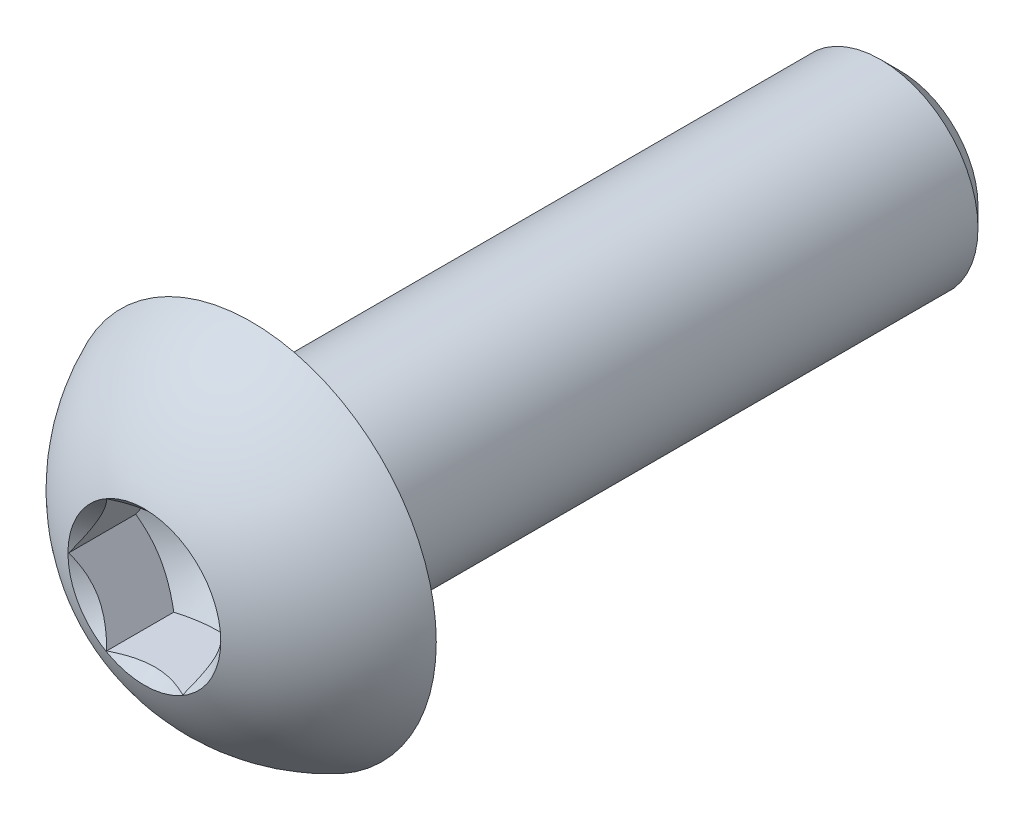
ISO-10303-21;
HEADER;
FILE_DESCRIPTION(('STEP AP214'),'2;1');
FILE_NAME('part.step','',(''),(''),'','','');
FILE_SCHEMA(('AUTOMOTIVE_DESIGN { 1 0 10303 214 1 1 1 1 }'));
ENDSEC;
DATA;
#1=APPLICATION_CONTEXT('core data for automotive mechanical design processes');
#2=APPLICATION_PROTOCOL_DEFINITION('international standard','automotive_design',2000,#1);
#3=PRODUCT_CONTEXT('',#1,'mechanical');
#4=PRODUCT('Part','Part','',(#3));
#5=PRODUCT_RELATED_PRODUCT_CATEGORY('part','',(#4));
#6=PRODUCT_DEFINITION_FORMATION('','',#4);
#7=PRODUCT_DEFINITION_CONTEXT('part definition',#1,'design');
#8=PRODUCT_DEFINITION('design','',#6,#7);
#9=PRODUCT_DEFINITION_SHAPE('','',#8);
#10=(LENGTH_UNIT() NAMED_UNIT(*) SI_UNIT(.MILLI.,.METRE.));
#11=(NAMED_UNIT(*) PLANE_ANGLE_UNIT() SI_UNIT($,.RADIAN.));
#12=(NAMED_UNIT(*) SI_UNIT($,.STERADIAN.) SOLID_ANGLE_UNIT());
#13=UNCERTAINTY_MEASURE_WITH_UNIT(LENGTH_MEASURE(1.E-05),#10,'distance_accuracy_value','');
#14=(GEOMETRIC_REPRESENTATION_CONTEXT(3) GLOBAL_UNCERTAINTY_ASSIGNED_CONTEXT((#13)) GLOBAL_UNIT_ASSIGNED_CONTEXT((#10,
#11,#12)) REPRESENTATION_CONTEXT('',''));
#15=CARTESIAN_POINT('',(0.,0.,0.));
#16=DIRECTION('',(0.,0.,1.));
#17=DIRECTION('',(1.,0.,0.));
#18=AXIS2_PLACEMENT_3D('',#15,#16,#17);
#19=CARTESIAN_POINT('',(0.,0.,-10.));
#20=DIRECTION('',(0.,0.,1.));
#21=DIRECTION('',(1.,0.,0.));
#22=AXIS2_PLACEMENT_3D('',#19,#20,#21);
#23=PLANE('',#22);
#24=CARTESIAN_POINT('',(0.,0.,-10.));
#25=DIRECTION('',(0.,0.,1.));
#26=DIRECTION('',(1.,0.,0.));
#27=AXIS2_PLACEMENT_3D('',#24,#25,#26);
#28=CIRCLE('',#27,1.2);
#29=CARTESIAN_POINT('',(1.2,0.,-10.));
#30=VERTEX_POINT('',#29);
#31=EDGE_CURVE('E11',#30,#30,#28,.T.);
#32=ORIENTED_EDGE('',*,*,#31,.F.);
#33=EDGE_LOOP('',(#32));
#34=FACE_BOUND('',#33,.T.);
#35=ADVANCED_FACE('F17',(#34),#23,.F.);
#36=CARTESIAN_POINT('',(0.,0.,0.02709501704973));
#37=DIRECTION('',(0.,0.,-1.));
#38=DIRECTION('',(0.,-1.,0.));
#39=AXIS2_PLACEMENT_3D('',#36,#37,#38);
#40=PLANE('',#39);
#41=CARTESIAN_POINT('',(0.,0.,0.02709501704973));
#42=DIRECTION('',(0.,0.,-1.));
#43=DIRECTION('',(-1.,0.,0.));
#44=AXIS2_PLACEMENT_3D('',#41,#42,#43);
#45=CIRCLE('',#44,0.1624);
#46=CARTESIAN_POINT('',(-0.1624,0.,0.02709501704973));
#47=VERTEX_POINT('',#46);
#48=EDGE_CURVE('E157',#47,#47,#45,.T.);
#49=ORIENTED_EDGE('',*,*,#48,.F.);
#50=EDGE_LOOP('',(#49));
#51=FACE_BOUND('',#50,.T.);
#52=ADVANCED_FACE('F326',(#51),#40,.F.);
#53=CARTESIAN_POINT('',(0.,0.,-9.7));
#54=DIRECTION('',(0.,0.,1.));
#55=DIRECTION('',(1.,0.,0.));
#56=AXIS2_PLACEMENT_3D('',#53,#54,#55);
#57=CONICAL_SURFACE('',#56,1.5,0.785398163397);
#58=DIRECTION('',(-0.707106781186548,0.,-0.707106781186548));
#59=VECTOR('',#58,1.);
#60=CARTESIAN_POINT('',(1.5,0.,-9.7));
#61=LINE('',#60,#59);
#62=CARTESIAN_POINT('',(1.5,0.,-9.7));
#63=VERTEX_POINT('',#62);
#64=EDGE_CURVE('E30',#63,#30,#61,.T.);
#65=ORIENTED_EDGE('',*,*,#64,.T.);
#66=ORIENTED_EDGE('',*,*,#31,.T.);
#67=ORIENTED_EDGE('',*,*,#64,.F.);
#68=CARTESIAN_POINT('',(0.,0.,-9.7));
#69=DIRECTION('',(0.,0.,1.));
#70=DIRECTION('',(1.,0.,0.));
#71=AXIS2_PLACEMENT_3D('',#68,#69,#70);
#72=CIRCLE('',#71,1.5);
#73=EDGE_CURVE('E148',#63,#63,#72,.T.);
#74=ORIENTED_EDGE('',*,*,#73,.F.);
#75=EDGE_LOOP('',(#65,#66,#67,#74));
#76=FACE_BOUND('',#75,.T.);
#77=ADVANCED_FACE('F163',(#76),#57,.T.);
#78=CARTESIAN_POINT('',(0.,0.,2.69));
#79=DIRECTION('',(0.,0.,1.));
#80=DIRECTION('',(-1.,0.,0.));
#81=AXIS2_PLACEMENT_3D('',#78,#79,#80);
#82=CONICAL_SURFACE('',#81,4.774686726198,1.047197551197);
#83=CARTESIAN_POINT('',(-1.17202104645414,-1.28130839271989E-12,0.609999999999112));
#84=CARTESIAN_POINT('',(-0.879015784840616,-0.507500000000666,0.440833333332957));
#85=CARTESIAN_POINT('',(-0.586010523226831,-1.01500000000049,0.609999999999704));
#86=(BOUNDED_CURVE() B_SPLINE_CURVE(2,(#83,#84,#85),.UNSPECIFIED.,.F.,
.F.) B_SPLINE_CURVE_WITH_KNOTS((3,3),(0.,1.),
.UNSPECIFIED.) CURVE() GEOMETRIC_REPRESENTATION_ITEM() RATIONAL_B_SPLINE_CURVE((1.,
1.15470053837917,1.)) REPRESENTATION_ITEM(''));
#87=CARTESIAN_POINT('',(-1.172021046455,0.,0.61));
#88=VERTEX_POINT('',#87);
#89=CARTESIAN_POINT('',(-0.586010523227,-1.015,0.61));
#90=VERTEX_POINT('',#89);
#91=EDGE_CURVE('E100',#88,#90,#86,.T.);
#92=ORIENTED_EDGE('',*,*,#91,.T.);
#93=CARTESIAN_POINT('',(-0.586010523224638,-1.015,0.609999999998636));
#94=CARTESIAN_POINT('',(1.18138832050363E-12,-1.015,0.440833333333196));
#95=CARTESIAN_POINT('',(0.586010523227788,-1.015,0.609999999999545));
#96=(BOUNDED_CURVE() B_SPLINE_CURVE(2,(#93,#94,#95),.UNSPECIFIED.,.F.,
.F.) B_SPLINE_CURVE_WITH_KNOTS((3,3),(0.,1.),
.UNSPECIFIED.) CURVE() GEOMETRIC_REPRESENTATION_ITEM() RATIONAL_B_SPLINE_CURVE((1.,
1.15470053837863,1.)) REPRESENTATION_ITEM(''));
#97=CARTESIAN_POINT('',(0.586010523227,-1.015,0.61));
#98=VERTEX_POINT('',#97);
#99=EDGE_CURVE('E93',#90,#98,#96,.T.);
#100=ORIENTED_EDGE('',*,*,#99,.T.);
#101=CARTESIAN_POINT('',(0.586010523227856,-1.01499999999872,0.609999999999113));
#102=CARTESIAN_POINT('',(0.879015784841384,-0.507499999999334,0.440833333332957));
#103=CARTESIAN_POINT('',(1.17202104645517,4.94160268260657E-13,0.609999999999704));
#104=(BOUNDED_CURVE() B_SPLINE_CURVE(2,(#101,#102,#103),.UNSPECIFIED.,.F.,
.F.) B_SPLINE_CURVE_WITH_KNOTS((3,3),(0.,1.),
.UNSPECIFIED.) CURVE() GEOMETRIC_REPRESENTATION_ITEM() RATIONAL_B_SPLINE_CURVE((1.,
1.15470053837918,1.)) REPRESENTATION_ITEM(''));
#105=CARTESIAN_POINT('',(1.172021046455,0.,0.61));
#106=VERTEX_POINT('',#105);
#107=EDGE_CURVE('E97',#98,#106,#104,.T.);
#108=ORIENTED_EDGE('',*,*,#107,.T.);
#109=CARTESIAN_POINT('',(1.17202104645414,1.28053123660266E-12,0.609999999999113));
#110=CARTESIAN_POINT('',(0.879015784840616,0.507500000000666,0.440833333332957));
#111=CARTESIAN_POINT('',(0.586010523226831,1.01500000000049,0.609999999999704));
#112=(BOUNDED_CURVE() B_SPLINE_CURVE(2,(#109,#110,#111),.UNSPECIFIED.,.F.,
.F.) B_SPLINE_CURVE_WITH_KNOTS((3,3),(0.,1.),
.UNSPECIFIED.) CURVE() GEOMETRIC_REPRESENTATION_ITEM() RATIONAL_B_SPLINE_CURVE((1.,
1.15470053837917,1.)) REPRESENTATION_ITEM(''));
#113=CARTESIAN_POINT('',(0.586010523227,1.015,0.61));
#114=VERTEX_POINT('',#113);
#115=EDGE_CURVE('E125',#106,#114,#112,.T.);
#116=ORIENTED_EDGE('',*,*,#115,.T.);
#117=CARTESIAN_POINT('',(0.586010523224638,1.015,0.609999999998636));
#118=CARTESIAN_POINT('',(-1.18138832050363E-12,1.015,0.440833333333196));
#119=CARTESIAN_POINT('',(-0.586010523227788,1.015,0.609999999999545));
#120=(BOUNDED_CURVE() B_SPLINE_CURVE(2,(#117,#118,#119),.UNSPECIFIED.,.F.,
.F.) B_SPLINE_CURVE_WITH_KNOTS((3,3),(0.,1.),
.UNSPECIFIED.) CURVE() GEOMETRIC_REPRESENTATION_ITEM() RATIONAL_B_SPLINE_CURVE((1.,
1.15470053837863,1.)) REPRESENTATION_ITEM(''));
#121=CARTESIAN_POINT('',(-0.586010523227,1.015,0.61));
#122=VERTEX_POINT('',#121);
#123=EDGE_CURVE('E190',#114,#122,#120,.T.);
#124=ORIENTED_EDGE('',*,*,#123,.T.);
#125=CARTESIAN_POINT('',(-0.586010523227856,1.01499999999872,0.609999999999113));
#126=CARTESIAN_POINT('',(-0.879015784841384,0.507499999999334,0.440833333332957));
#127=CARTESIAN_POINT('',(-1.17202104645517,-4.94604357470507E-13,0.609999999999704));
#128=(BOUNDED_CURVE() B_SPLINE_CURVE(2,(#125,#126,#127),.UNSPECIFIED.,.F.,
.F.) B_SPLINE_CURVE_WITH_KNOTS((3,3),(0.,1.),
.UNSPECIFIED.) CURVE() GEOMETRIC_REPRESENTATION_ITEM() RATIONAL_B_SPLINE_CURVE((1.,
1.15470053837918,1.)) REPRESENTATION_ITEM(''));
#129=EDGE_CURVE('E147',#122,#88,#128,.T.);
#130=ORIENTED_EDGE('',*,*,#129,.T.);
#131=DIRECTION('',(0.866025403784329,0.,-0.50000000000019));
#132=VECTOR('',#131,1.);
#133=CARTESIAN_POINT('',(-4.774686726198,0.,2.69));
#134=LINE('',#133,#132);
#135=EDGE_CURVE('E152',#88,#47,#134,.T.);
#136=ORIENTED_EDGE('',*,*,#135,.T.);
#137=ORIENTED_EDGE('',*,*,#48,.T.);
#138=ORIENTED_EDGE('',*,*,#135,.F.);
#139=EDGE_LOOP('',(#92,#100,#108,#116,#124,#130,#136,#137,#138));
#140=FACE_BOUND('',#139,.T.);
#141=ADVANCED_FACE('F95',(#140),#82,.F.);
#142=CARTESIAN_POINT('',(0.,0.,-0.1));
#143=DIRECTION('',(0.,0.,-1.));
#144=DIRECTION('',(1.,0.,0.));
#145=AXIS2_PLACEMENT_3D('',#142,#143,#144);
#146=CYLINDRICAL_SURFACE('',#145,1.5);
#147=DIRECTION('',(0.,0.,-1.));
#148=VECTOR('',#147,1.);
#149=CARTESIAN_POINT('',(1.5,0.,-0.1));
#150=LINE('',#149,#148);
#151=CARTESIAN_POINT('',(1.5,0.,-0.1));
#152=VERTEX_POINT('',#151);
#153=EDGE_CURVE('E153',#152,#63,#150,.T.);
#154=ORIENTED_EDGE('',*,*,#153,.T.);
#155=ORIENTED_EDGE('',*,*,#73,.T.);
#156=ORIENTED_EDGE('',*,*,#153,.F.);
#157=CARTESIAN_POINT('',(0.,0.,-0.1));
#158=DIRECTION('',(0.,0.,1.));
#159=DIRECTION('',(1.,0.,0.));
#160=AXIS2_PLACEMENT_3D('',#157,#158,#159);
#161=CIRCLE('',#160,1.5);
#162=EDGE_CURVE('E169',#152,#152,#161,.T.);
#163=ORIENTED_EDGE('',*,*,#162,.F.);
#164=EDGE_LOOP('',(#154,#155,#156,#163));
#165=FACE_BOUND('',#164,.T.);
#166=ADVANCED_FACE('F166',(#165),#146,.T.);
#167=CARTESIAN_POINT('',(-1.172021046455,0.,2.69));
#168=DIRECTION('',(0.866025403784329,-0.50000000000019,0.));
#169=DIRECTION('',(0.,0.,-1.));
#170=AXIS2_PLACEMENT_3D('',#167,#168,#169);
#171=PLANE('',#170);
#172=CARTESIAN_POINT('',(-0.586010523226969,1.01500000000025,1.64413989476824));
#173=CARTESIAN_POINT('',(-0.879015784840941,0.507500000000102,1.35113463315404));
#174=CARTESIAN_POINT('',(-1.17202104645487,0.,1.64413989476808));
#175=(BOUNDED_CURVE() B_SPLINE_CURVE(2,(#172,#173,#174),.UNSPECIFIED.,.F.,
.F.) B_SPLINE_CURVE_WITH_KNOTS((3,3),(0.,1.),
.UNSPECIFIED.) CURVE() GEOMETRIC_REPRESENTATION_ITEM() RATIONAL_B_SPLINE_CURVE((1.,
1.15470053837946,1.)) REPRESENTATION_ITEM(''));
#176=CARTESIAN_POINT('',(-0.586010523227,1.015,1.644139894768));
#177=VERTEX_POINT('',#176);
#178=CARTESIAN_POINT('',(-1.172021046455,0.,1.644139894768));
#179=VERTEX_POINT('',#178);
#180=EDGE_CURVE('E218',#177,#179,#175,.T.);
#181=ORIENTED_EDGE('',*,*,#180,.T.);
#182=DIRECTION('',(0.,0.,-1.));
#183=VECTOR('',#182,1.);
#184=CARTESIAN_POINT('',(-1.172021046455,0.,2.69));
#185=LINE('',#184,#183);
#186=EDGE_CURVE('E140',#179,#88,#185,.T.);
#187=ORIENTED_EDGE('',*,*,#186,.T.);
#188=ORIENTED_EDGE('',*,*,#129,.F.);
#189=DIRECTION('',(0.,0.,-1.));
#190=VECTOR('',#189,1.);
#191=CARTESIAN_POINT('',(-0.586010523227,1.015,2.69));
#192=LINE('',#191,#190);
#193=EDGE_CURVE('E197',#177,#122,#192,.T.);
#194=ORIENTED_EDGE('',*,*,#193,.F.);
#195=EDGE_LOOP('',(#181,#187,#188,#194));
#196=FACE_BOUND('',#195,.T.);
#197=ADVANCED_FACE('F281',(#196),#171,.T.);
#198=CARTESIAN_POINT('',(-0.586010523227,-1.015,2.69));
#199=DIRECTION('',(0.866025403784329,0.50000000000019,0.));
#200=DIRECTION('',(0.,0.,-1.));
#201=AXIS2_PLACEMENT_3D('',#198,#199,#200);
#202=PLANE('',#201);
#203=CARTESIAN_POINT('',(-1.17202104645503,2.54352094941624E-13,1.64413989476824));
#204=CARTESIAN_POINT('',(-0.879015784841057,-0.507499999999898,1.35113463315404));
#205=CARTESIAN_POINT('',(-0.586010523227127,-1.01499999999998,1.64413989476808));
#206=(BOUNDED_CURVE() B_SPLINE_CURVE(2,(#203,#204,#205),.UNSPECIFIED.,.F.,
.F.) B_SPLINE_CURVE_WITH_KNOTS((3,3),(0.,1.),
.UNSPECIFIED.) CURVE() GEOMETRIC_REPRESENTATION_ITEM() RATIONAL_B_SPLINE_CURVE((1.,
1.15470053837946,1.)) REPRESENTATION_ITEM(''));
#207=CARTESIAN_POINT('',(-0.586010523227,-1.015,1.644139894768));
#208=VERTEX_POINT('',#207);
#209=EDGE_CURVE('E226',#179,#208,#206,.T.);
#210=ORIENTED_EDGE('',*,*,#209,.T.);
#211=DIRECTION('',(0.,0.,-1.));
#212=VECTOR('',#211,1.);
#213=CARTESIAN_POINT('',(-0.586010523227,-1.015,2.69));
#214=LINE('',#213,#212);
#215=EDGE_CURVE('E104',#208,#90,#214,.T.);
#216=ORIENTED_EDGE('',*,*,#215,.T.);
#217=ORIENTED_EDGE('',*,*,#91,.F.);
#218=ORIENTED_EDGE('',*,*,#186,.F.);
#219=EDGE_LOOP('',(#210,#216,#217,#218));
#220=FACE_BOUND('',#219,.T.);
#221=ADVANCED_FACE('F315',(#220),#202,.T.);
#222=CARTESIAN_POINT('',(0.586010523227,-1.015,2.69));
#223=DIRECTION('',(0.,1.,0.));
#224=DIRECTION('',(1.,0.,0.));
#225=AXIS2_PLACEMENT_3D('',#222,#223,#224);
#226=PLANE('',#225);
#227=CARTESIAN_POINT('',(-0.586010523226411,-1.015,1.64413989476741));
#228=CARTESIAN_POINT('',(2.94653190735516E-13,-1.015,1.35113463315446));
#229=CARTESIAN_POINT('',(0.586010523227197,-1.015,1.64413989476781));
#230=(BOUNDED_CURVE() B_SPLINE_CURVE(2,(#227,#228,#229),.UNSPECIFIED.,.F.,
.F.) B_SPLINE_CURVE_WITH_KNOTS((3,3),(0.,1.),
.UNSPECIFIED.) CURVE() GEOMETRIC_REPRESENTATION_ITEM() RATIONAL_B_SPLINE_CURVE((1.,
1.15470053837892,1.)) REPRESENTATION_ITEM(''));
#231=CARTESIAN_POINT('',(0.586010523227,-1.015,1.644139894768));
#232=VERTEX_POINT('',#231);
#233=EDGE_CURVE('E111',#208,#232,#230,.T.);
#234=ORIENTED_EDGE('',*,*,#233,.T.);
#235=DIRECTION('',(0.,0.,-1.));
#236=VECTOR('',#235,1.);
#237=CARTESIAN_POINT('',(0.586010523227,-1.015,2.69));
#238=LINE('',#237,#236);
#239=EDGE_CURVE('E105',#232,#98,#238,.T.);
#240=ORIENTED_EDGE('',*,*,#239,.T.);
#241=ORIENTED_EDGE('',*,*,#99,.F.);
#242=ORIENTED_EDGE('',*,*,#215,.F.);
#243=EDGE_LOOP('',(#234,#240,#241,#242));
#244=FACE_BOUND('',#243,.T.);
#245=ADVANCED_FACE('F109',(#244),#226,.T.);
#246=CARTESIAN_POINT('',(1.172021046455,0.,2.69));
#247=DIRECTION('',(-0.866025403784329,0.50000000000019,0.));
#248=DIRECTION('',(0.,0.,1.));
#249=AXIS2_PLACEMENT_3D('',#246,#247,#248);
#250=PLANE('',#249);
#251=CARTESIAN_POINT('',(0.586010523226969,-1.01500000000025,1.64413989476824));
#252=CARTESIAN_POINT('',(0.879015784840941,-0.507500000000102,1.35113463315404));
#253=CARTESIAN_POINT('',(1.17202104645487,0.,1.64413989476808));
#254=(BOUNDED_CURVE() B_SPLINE_CURVE(2,(#251,#252,#253),.UNSPECIFIED.,.F.,
.F.) B_SPLINE_CURVE_WITH_KNOTS((3,3),(0.,1.),
.UNSPECIFIED.) CURVE() GEOMETRIC_REPRESENTATION_ITEM() RATIONAL_B_SPLINE_CURVE((1.,
1.15470053837946,1.)) REPRESENTATION_ITEM(''));
#255=CARTESIAN_POINT('',(1.172021046455,0.,1.644139894768));
#256=VERTEX_POINT('',#255);
#257=EDGE_CURVE('E207',#232,#256,#254,.T.);
#258=ORIENTED_EDGE('',*,*,#257,.T.);
#259=DIRECTION('',(0.,0.,-1.));
#260=VECTOR('',#259,1.);
#261=CARTESIAN_POINT('',(1.172021046455,0.,2.69));
#262=LINE('',#261,#260);
#263=EDGE_CURVE('E119',#256,#106,#262,.T.);
#264=ORIENTED_EDGE('',*,*,#263,.T.);
#265=ORIENTED_EDGE('',*,*,#107,.F.);
#266=ORIENTED_EDGE('',*,*,#239,.F.);
#267=EDGE_LOOP('',(#258,#264,#265,#266));
#268=FACE_BOUND('',#267,.T.);
#269=ADVANCED_FACE('F117',(#268),#250,.T.);
#270=CARTESIAN_POINT('',(0.586010523227,1.015,2.69));
#271=DIRECTION('',(-0.866025403784329,-0.50000000000019,0.));
#272=DIRECTION('',(-0.50000000000019,0.866025403784329,0.));
#273=AXIS2_PLACEMENT_3D('',#270,#271,#272);
#274=PLANE('',#273);
#275=CARTESIAN_POINT('',(1.17202104645503,-2.55129251058861E-13,1.64413989476824));
#276=CARTESIAN_POINT('',(0.879015784841059,0.507499999999899,1.35113463315404));
#277=CARTESIAN_POINT('',(0.586010523227127,1.01499999999998,1.64413989476808));
#278=(BOUNDED_CURVE() B_SPLINE_CURVE(2,(#275,#276,#277),.UNSPECIFIED.,.F.,
.F.) B_SPLINE_CURVE_WITH_KNOTS((3,3),(0.,1.),
.UNSPECIFIED.) CURVE() GEOMETRIC_REPRESENTATION_ITEM() RATIONAL_B_SPLINE_CURVE((1.,
1.15470053837946,1.)) REPRESENTATION_ITEM(''));
#279=CARTESIAN_POINT('',(0.586010523227,1.015,1.644139894768));
#280=VERTEX_POINT('',#279);
#281=EDGE_CURVE('E198',#256,#280,#278,.T.);
#282=ORIENTED_EDGE('',*,*,#281,.T.);
#283=DIRECTION('',(0.,0.,-1.));
#284=VECTOR('',#283,1.);
#285=CARTESIAN_POINT('',(0.586010523227,1.015,2.69));
#286=LINE('',#285,#284);
#287=EDGE_CURVE('E196',#280,#114,#286,.T.);
#288=ORIENTED_EDGE('',*,*,#287,.T.);
#289=ORIENTED_EDGE('',*,*,#115,.F.);
#290=ORIENTED_EDGE('',*,*,#263,.F.);
#291=EDGE_LOOP('',(#282,#288,#289,#290));
#292=FACE_BOUND('',#291,.T.);
#293=ADVANCED_FACE('F273',(#292),#274,.T.);
#294=CARTESIAN_POINT('',(-0.586010523227,1.015,2.69));
#295=DIRECTION('',(0.,-1.,0.));
#296=DIRECTION('',(0.,0.,-1.));
#297=AXIS2_PLACEMENT_3D('',#294,#295,#296);
#298=PLANE('',#297);
#299=CARTESIAN_POINT('',(0.586010523226411,1.015,1.64413989476741));
#300=CARTESIAN_POINT('',(-2.94875235340442E-13,1.015,1.35113463315445));
#301=CARTESIAN_POINT('',(-0.586010523227197,1.015,1.64413989476781));
#302=(BOUNDED_CURVE() B_SPLINE_CURVE(2,(#299,#300,#301),.UNSPECIFIED.,.F.,
.F.) B_SPLINE_CURVE_WITH_KNOTS((3,3),(0.,1.),
.UNSPECIFIED.) CURVE() GEOMETRIC_REPRESENTATION_ITEM() RATIONAL_B_SPLINE_CURVE((1.,
1.15470053837892,1.)) REPRESENTATION_ITEM(''));
#303=EDGE_CURVE('E208',#280,#177,#302,.T.);
#304=ORIENTED_EDGE('',*,*,#303,.T.);
#305=ORIENTED_EDGE('',*,*,#193,.T.);
#306=ORIENTED_EDGE('',*,*,#123,.F.);
#307=ORIENTED_EDGE('',*,*,#287,.F.);
#308=EDGE_LOOP('',(#304,#305,#306,#307));
#309=FACE_BOUND('',#308,.T.);
#310=ADVANCED_FACE('F277',(#309),#298,.T.);
#311=CARTESIAN_POINT('',(1.6,0.,0.));
#312=CARTESIAN_POINT('',(1.54142135623731,0.,0.));
#313=CARTESIAN_POINT('',(1.5,0.,-0.0414213562373095));
#314=CARTESIAN_POINT('',(1.5,0.,-0.1));
#315=(BOUNDED_CURVE() B_SPLINE_CURVE(3,(#311,#312,#313,#314),.UNSPECIFIED.,.F.,
.F.) B_SPLINE_CURVE_WITH_KNOTS((4,4),(0.,1.),
.UNSPECIFIED.) CURVE() GEOMETRIC_REPRESENTATION_ITEM() RATIONAL_B_SPLINE_CURVE((1.,
0.804737854124365,0.804737854124365,1.)) REPRESENTATION_ITEM(''));
#316=CARTESIAN_POINT('',(0.,0.,0.));
#317=DIRECTION('',(0.,0.,-1.));
#318=AXIS1_PLACEMENT('',#316,#317);
#319=SURFACE_OF_REVOLUTION('',#315,#318);
#320=CARTESIAN_POINT('',(1.6,0.,-0.1));
#321=DIRECTION('',(0.,-1.,0.));
#322=DIRECTION('',(0.,0.,1.));
#323=AXIS2_PLACEMENT_3D('',#320,#321,#322);
#324=CIRCLE('',#323,0.1);
#325=CARTESIAN_POINT('',(1.6,0.,0.));
#326=VERTEX_POINT('',#325);
#327=EDGE_CURVE('E217',#326,#152,#324,.T.);
#328=ORIENTED_EDGE('',*,*,#327,.T.);
#329=ORIENTED_EDGE('',*,*,#162,.T.);
#330=ORIENTED_EDGE('',*,*,#327,.F.);
#331=CARTESIAN_POINT('',(0.,0.,0.));
#332=DIRECTION('',(0.,0.,1.));
#333=DIRECTION('',(1.,0.,0.));
#334=AXIS2_PLACEMENT_3D('',#331,#332,#333);
#335=CIRCLE('',#334,1.6);
#336=EDGE_CURVE('E189',#326,#326,#335,.T.);
#337=ORIENTED_EDGE('',*,*,#336,.F.);
#338=EDGE_LOOP('',(#328,#329,#330,#337));
#339=FACE_BOUND('',#338,.T.);
#340=ADVANCED_FACE('F19',(#339),#319,.T.);
#341=CARTESIAN_POINT('',(0.,0.,2.69));
#342=DIRECTION('',(0.,0.,1.));
#343=DIRECTION('',(-1.,0.,0.));
#344=AXIS2_PLACEMENT_3D('',#341,#342,#343);
#345=CONICAL_SURFACE('',#344,2.217881151687,0.785398163397);
#346=ORIENTED_EDGE('',*,*,#281,.F.);
#347=ORIENTED_EDGE('',*,*,#257,.F.);
#348=ORIENTED_EDGE('',*,*,#233,.F.);
#349=ORIENTED_EDGE('',*,*,#209,.F.);
#350=DIRECTION('',(0.707106781186548,0.,-0.707106781186548));
#351=VECTOR('',#350,1.);
#352=CARTESIAN_POINT('',(-2.217881151687,0.,2.69));
#353=LINE('',#352,#351);
#354=CARTESIAN_POINT('',(-1.177881151687,0.,1.65));
#355=VERTEX_POINT('',#354);
#356=EDGE_CURVE('E235',#355,#179,#353,.T.);
#357=ORIENTED_EDGE('',*,*,#356,.F.);
#358=CARTESIAN_POINT('',(0.,0.,1.65));
#359=DIRECTION('',(0.,0.,1.));
#360=DIRECTION('',(1.,0.,0.));
#361=AXIS2_PLACEMENT_3D('',#358,#359,#360);
#362=CIRCLE('',#361,1.177881151687);
#363=CARTESIAN_POINT('',(1.177881151687,0.,1.65));
#364=VERTEX_POINT('',#363);
#365=EDGE_CURVE('E182',#355,#364,#362,.T.);
#366=ORIENTED_EDGE('',*,*,#365,.T.);
#367=CARTESIAN_POINT('',(0.,0.,1.65));
#368=DIRECTION('',(0.,0.,1.));
#369=DIRECTION('',(1.,0.,0.));
#370=AXIS2_PLACEMENT_3D('',#367,#368,#369);
#371=CIRCLE('',#370,1.177881151687);
#372=EDGE_CURVE('E185',#364,#355,#371,.T.);
#373=ORIENTED_EDGE('',*,*,#372,.T.);
#374=ORIENTED_EDGE('',*,*,#356,.T.);
#375=ORIENTED_EDGE('',*,*,#180,.F.);
#376=ORIENTED_EDGE('',*,*,#303,.F.);
#377=EDGE_LOOP('',(#346,#347,#348,#349,#357,#366,#373,#374,#375,#376));
#378=FACE_BOUND('',#377,.T.);
#379=ADVANCED_FACE('F311',(#378),#345,.F.);
#380=CARTESIAN_POINT('',(0.,0.,0.));
#381=DIRECTION('',(0.,0.,1.));
#382=DIRECTION('',(1.,0.,0.));
#383=AXIS2_PLACEMENT_3D('',#380,#381,#382);
#384=PLANE('',#383);
#385=ORIENTED_EDGE('',*,*,#336,.T.);
#386=EDGE_LOOP('',(#385));
#387=FACE_BOUND('',#386,.T.);
#388=CARTESIAN_POINT('',(0.,0.,0.));
#389=DIRECTION('',(0.,0.,1.));
#390=DIRECTION('',(1.,0.,0.));
#391=AXIS2_PLACEMENT_3D('',#388,#389,#390);
#392=CIRCLE('',#391,2.85);
#393=CARTESIAN_POINT('',(2.85,0.,0.));
#394=VERTEX_POINT('',#393);
#395=EDGE_CURVE('E374',#394,#394,#392,.T.);
#396=ORIENTED_EDGE('',*,*,#395,.F.);
#397=EDGE_LOOP('',(#396));
#398=FACE_BOUND('',#397,.T.);
#399=ADVANCED_FACE('F362',(#387,#398),#384,.F.);
#400=CARTESIAN_POINT('',(0.,0.,-1.215938179545));
#401=DIRECTION('',(0.,0.,-1.));
#402=DIRECTION('',(1.,0.,0.));
#403=AXIS2_PLACEMENT_3D('',#400,#401,#402);
#404=SPHERICAL_SURFACE('',#403,3.098548959832);
#405=ORIENTED_EDGE('',*,*,#395,.T.);
#406=CARTESIAN_POINT('',(0.,0.,-1.215938179545));
#407=DIRECTION('',(0.,1.,0.));
#408=DIRECTION('',(0.380139596617069,0.,0.924929125438167));
#409=AXIS2_PLACEMENT_3D('',#406,#407,#408);
#410=CIRCLE('',#409,3.098548959832);
#411=EDGE_CURVE('E181',#364,#394,#410,.T.);
#412=ORIENTED_EDGE('',*,*,#411,.F.);
#413=ORIENTED_EDGE('',*,*,#365,.F.);
#414=ORIENTED_EDGE('',*,*,#372,.F.);
#415=ORIENTED_EDGE('',*,*,#411,.T.);
#416=EDGE_LOOP('',(#405,#412,#413,#414,#415));
#417=FACE_BOUND('',#416,.T.);
#418=ADVANCED_FACE('F359',(#417),#404,.T.);
#419=CLOSED_SHELL('',(#35,#52,#77,#141,#166,#197,#221,#245,#269,#293,#310,#340,#379,#399,#418));
#420=MANIFOLD_SOLID_BREP('B1',#419);
#421=ADVANCED_BREP_SHAPE_REPRESENTATION('',(#18,#420),#14);
#422=SHAPE_DEFINITION_REPRESENTATION(#9,#421);
ENDSEC;
END-ISO-10303-21;
